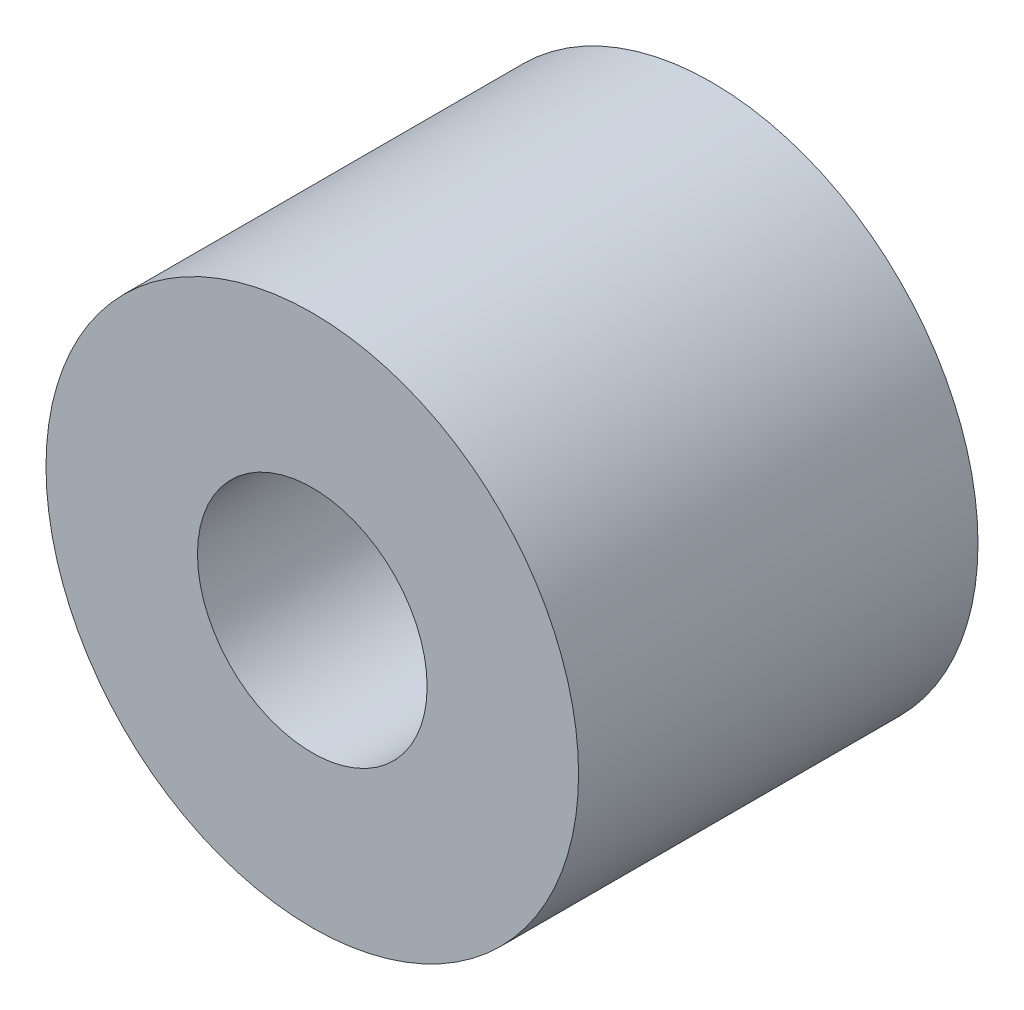
ISO-10303-21;
HEADER;
FILE_DESCRIPTION(('STEP AP214'),'2;1');
FILE_NAME('part.step','',(''),(''),'','','');
FILE_SCHEMA(('AUTOMOTIVE_DESIGN { 1 0 10303 214 1 1 1 1 }'));
ENDSEC;
DATA;
#1=APPLICATION_CONTEXT('core data for automotive mechanical design processes');
#2=APPLICATION_PROTOCOL_DEFINITION('international standard','automotive_design',2000,#1);
#3=PRODUCT_CONTEXT('',#1,'mechanical');
#4=PRODUCT('Part','Part','',(#3));
#5=PRODUCT_RELATED_PRODUCT_CATEGORY('part','',(#4));
#6=PRODUCT_DEFINITION_FORMATION('','',#4);
#7=PRODUCT_DEFINITION_CONTEXT('part definition',#1,'design');
#8=PRODUCT_DEFINITION('design','',#6,#7);
#9=PRODUCT_DEFINITION_SHAPE('','',#8);
#10=(LENGTH_UNIT() NAMED_UNIT(*) SI_UNIT(.MILLI.,.METRE.));
#11=(NAMED_UNIT(*) PLANE_ANGLE_UNIT() SI_UNIT($,.RADIAN.));
#12=(NAMED_UNIT(*) SI_UNIT($,.STERADIAN.) SOLID_ANGLE_UNIT());
#13=UNCERTAINTY_MEASURE_WITH_UNIT(LENGTH_MEASURE(1.E-05),#10,'distance_accuracy_value','');
#14=(GEOMETRIC_REPRESENTATION_CONTEXT(3) GLOBAL_UNCERTAINTY_ASSIGNED_CONTEXT((#13)) GLOBAL_UNIT_ASSIGNED_CONTEXT((#10,
#11,#12)) REPRESENTATION_CONTEXT('',''));
#15=CARTESIAN_POINT('',(0.,0.,0.));
#16=DIRECTION('',(0.,0.,1.));
#17=DIRECTION('',(1.,0.,0.));
#18=AXIS2_PLACEMENT_3D('',#15,#16,#17);
#19=CARTESIAN_POINT('',(0.,0.,6.));
#20=DIRECTION('',(0.,0.,1.));
#21=DIRECTION('',(1.,0.,0.));
#22=AXIS2_PLACEMENT_3D('',#19,#20,#21);
#23=PLANE('',#22);
#24=CARTESIAN_POINT('',(0.,0.,6.));
#25=DIRECTION('',(0.,0.,1.));
#26=DIRECTION('',(1.,0.,0.));
#27=AXIS2_PLACEMENT_3D('',#24,#25,#26);
#28=CIRCLE('',#27,4.);
#29=CARTESIAN_POINT('',(4.,0.,6.));
#30=VERTEX_POINT('',#29);
#31=EDGE_CURVE('E10',#30,#30,#28,.T.);
#32=ORIENTED_EDGE('',*,*,#31,.T.);
#33=EDGE_LOOP('',(#32));
#34=FACE_BOUND('',#33,.T.);
#35=CARTESIAN_POINT('',(0.,0.,6.));
#36=DIRECTION('',(0.,0.,1.));
#37=DIRECTION('',(1.,0.,0.));
#38=AXIS2_PLACEMENT_3D('',#35,#36,#37);
#39=CIRCLE('',#38,1.725);
#40=CARTESIAN_POINT('',(1.725,0.,6.));
#41=VERTEX_POINT('',#40);
#42=EDGE_CURVE('E43',#41,#41,#39,.T.);
#43=ORIENTED_EDGE('',*,*,#42,.F.);
#44=EDGE_LOOP('',(#43));
#45=FACE_BOUND('',#44,.T.);
#46=ADVANCED_FACE('F32',(#34,#45),#23,.T.);
#47=CARTESIAN_POINT('',(0.,0.,0.));
#48=DIRECTION('',(0.,0.,1.));
#49=DIRECTION('',(1.,0.,0.));
#50=AXIS2_PLACEMENT_3D('',#47,#48,#49);
#51=PLANE('',#50);
#52=CARTESIAN_POINT('',(0.,0.,0.));
#53=DIRECTION('',(0.,0.,1.));
#54=DIRECTION('',(1.,0.,0.));
#55=AXIS2_PLACEMENT_3D('',#52,#53,#54);
#56=CIRCLE('',#55,4.);
#57=CARTESIAN_POINT('',(4.,0.,0.));
#58=VERTEX_POINT('',#57);
#59=EDGE_CURVE('E36',#58,#58,#56,.T.);
#60=ORIENTED_EDGE('',*,*,#59,.F.);
#61=EDGE_LOOP('',(#60));
#62=FACE_BOUND('',#61,.T.);
#63=CARTESIAN_POINT('',(0.,0.,0.));
#64=DIRECTION('',(0.,0.,1.));
#65=DIRECTION('',(1.,0.,0.));
#66=AXIS2_PLACEMENT_3D('',#63,#64,#65);
#67=CIRCLE('',#66,1.725);
#68=CARTESIAN_POINT('',(1.725,0.,0.));
#69=VERTEX_POINT('',#68);
#70=EDGE_CURVE('E45',#69,#69,#67,.T.);
#71=ORIENTED_EDGE('',*,*,#70,.T.);
#72=EDGE_LOOP('',(#71));
#73=FACE_BOUND('',#72,.T.);
#74=ADVANCED_FACE('F55',(#62,#73),#51,.F.);
#75=CARTESIAN_POINT('',(0.,0.,6.));
#76=DIRECTION('',(0.,0.,-1.));
#77=DIRECTION('',(-1.,0.,0.));
#78=AXIS2_PLACEMENT_3D('',#75,#76,#77);
#79=CYLINDRICAL_SURFACE('',#78,4.);
#80=ORIENTED_EDGE('',*,*,#31,.F.);
#81=EDGE_LOOP('',(#80));
#82=FACE_BOUND('',#81,.T.);
#83=ORIENTED_EDGE('',*,*,#59,.T.);
#84=EDGE_LOOP('',(#83));
#85=FACE_BOUND('',#84,.T.);
#86=ADVANCED_FACE('F34',(#82,#85),#79,.T.);
#87=CARTESIAN_POINT('',(0.,0.,6.));
#88=DIRECTION('',(0.,0.,-1.));
#89=DIRECTION('',(-1.,0.,0.));
#90=AXIS2_PLACEMENT_3D('',#87,#88,#89);
#91=CYLINDRICAL_SURFACE('',#90,1.725);
#92=ORIENTED_EDGE('',*,*,#42,.T.);
#93=EDGE_LOOP('',(#92));
#94=FACE_BOUND('',#93,.T.);
#95=ORIENTED_EDGE('',*,*,#70,.F.);
#96=EDGE_LOOP('',(#95));
#97=FACE_BOUND('',#96,.T.);
#98=ADVANCED_FACE('F51',(#94,#97),#91,.F.);
#99=CLOSED_SHELL('',(#46,#74,#86,#98));
#100=MANIFOLD_SOLID_BREP('B2',#99);
#101=ADVANCED_BREP_SHAPE_REPRESENTATION('',(#18,#100),#14);
#102=SHAPE_DEFINITION_REPRESENTATION(#9,#101);
ENDSEC;
END-ISO-10303-21;
